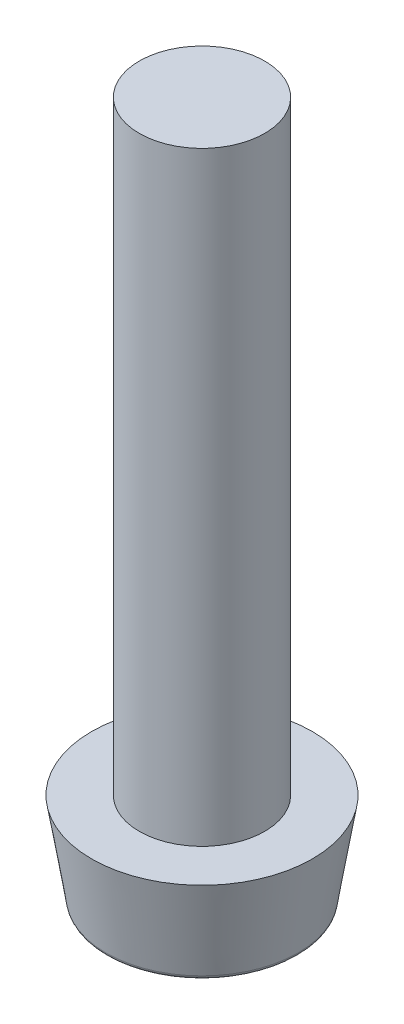
ISO-10303-21;
HEADER;
FILE_DESCRIPTION(('STEP AP214'),'2;1');
FILE_NAME('part.step','',(''),(''),'','','');
FILE_SCHEMA(('AUTOMOTIVE_DESIGN { 1 0 10303 214 1 1 1 1 }'));
ENDSEC;
DATA;
#1=APPLICATION_CONTEXT('core data for automotive mechanical design processes');
#2=APPLICATION_PROTOCOL_DEFINITION('international standard','automotive_design',2000,#1);
#3=PRODUCT_CONTEXT('',#1,'mechanical');
#4=PRODUCT('Part','Part','',(#3));
#5=PRODUCT_RELATED_PRODUCT_CATEGORY('part','',(#4));
#6=PRODUCT_DEFINITION_FORMATION('','',#4);
#7=PRODUCT_DEFINITION_CONTEXT('part definition',#1,'design');
#8=PRODUCT_DEFINITION('design','',#6,#7);
#9=PRODUCT_DEFINITION_SHAPE('','',#8);
#10=(LENGTH_UNIT() NAMED_UNIT(*) SI_UNIT(.MILLI.,.METRE.));
#11=(NAMED_UNIT(*) PLANE_ANGLE_UNIT() SI_UNIT($,.RADIAN.));
#12=(NAMED_UNIT(*) SI_UNIT($,.STERADIAN.) SOLID_ANGLE_UNIT());
#13=UNCERTAINTY_MEASURE_WITH_UNIT(LENGTH_MEASURE(1.E-05),#10,'distance_accuracy_value','');
#14=(GEOMETRIC_REPRESENTATION_CONTEXT(3) GLOBAL_UNCERTAINTY_ASSIGNED_CONTEXT((#13)) GLOBAL_UNIT_ASSIGNED_CONTEXT((#10,
#11,#12)) REPRESENTATION_CONTEXT('',''));
#15=CARTESIAN_POINT('',(0.,0.,0.));
#16=DIRECTION('',(0.,0.,1.));
#17=DIRECTION('',(1.,0.,0.));
#18=AXIS2_PLACEMENT_3D('',#15,#16,#17);
#19=CARTESIAN_POINT('',(0.,1.85,0.));
#20=DIRECTION('',(0.,1.,0.));
#21=DIRECTION('',(0.,0.,1.));
#22=AXIS2_PLACEMENT_3D('',#19,#20,#21);
#23=PLANE('',#22);
#24=CARTESIAN_POINT('',(0.,1.85,0.));
#25=DIRECTION('',(0.,1.,0.));
#26=DIRECTION('',(0.,0.,1.));
#27=AXIS2_PLACEMENT_3D('',#24,#25,#26);
#28=CIRCLE('',#27,1.25);
#29=CARTESIAN_POINT('',(0.,1.85,1.25));
#30=VERTEX_POINT('',#29);
#31=EDGE_CURVE('E50',#30,#30,#28,.T.);
#32=ORIENTED_EDGE('',*,*,#31,.F.);
#33=EDGE_LOOP('',(#32));
#34=FACE_BOUND('',#33,.T.);
#35=CARTESIAN_POINT('',(0.,1.85,0.));
#36=DIRECTION('',(0.,1.,0.));
#37=DIRECTION('',(0.,0.,1.));
#38=AXIS2_PLACEMENT_3D('',#35,#36,#37);
#39=CIRCLE('',#38,2.19999999999999);
#40=CARTESIAN_POINT('',(0.,1.85,2.19999999999999));
#41=VERTEX_POINT('',#40);
#42=EDGE_CURVE('E55',#41,#41,#39,.T.);
#43=ORIENTED_EDGE('',*,*,#42,.T.);
#44=EDGE_LOOP('',(#43));
#45=FACE_BOUND('',#44,.T.);
#46=ADVANCED_FACE('F37',(#34,#45),#23,.T.);
#47=CARTESIAN_POINT('',(0.,0.,0.));
#48=DIRECTION('',(0.,1.,0.));
#49=DIRECTION('',(0.,0.,1.));
#50=AXIS2_PLACEMENT_3D('',#47,#48,#49);
#51=PLANE('',#50);
#52=CARTESIAN_POINT('',(0.,0.,0.));
#53=DIRECTION('',(0.,1.,0.));
#54=DIRECTION('',(0.,0.,1.));
#55=AXIS2_PLACEMENT_3D('',#52,#53,#54);
#56=CIRCLE('',#55,1.81490991992436);
#57=CARTESIAN_POINT('',(0.,0.,1.81490991992436));
#58=VERTEX_POINT('',#57);
#59=EDGE_CURVE('E45',#58,#58,#56,.F.);
#60=ORIENTED_EDGE('',*,*,#59,.T.);
#61=EDGE_LOOP('',(#60));
#62=FACE_BOUND('',#61,.T.);
#63=ADVANCED_FACE('F71',(#62),#51,.F.);
#64=CARTESIAN_POINT('',(0.,13.9,0.));
#65=DIRECTION('',(0.,-1.,0.));
#66=DIRECTION('',(0.,0.,-1.));
#67=AXIS2_PLACEMENT_3D('',#64,#65,#66);
#68=CYLINDRICAL_SURFACE('',#67,1.25);
#69=CARTESIAN_POINT('',(0.,13.9,0.));
#70=DIRECTION('',(0.,1.,0.));
#71=DIRECTION('',(0.,0.,1.));
#72=AXIS2_PLACEMENT_3D('',#69,#70,#71);
#73=CIRCLE('',#72,1.25);
#74=CARTESIAN_POINT('',(0.,13.9,1.25));
#75=VERTEX_POINT('',#74);
#76=EDGE_CURVE('E60',#75,#75,#73,.T.);
#77=ORIENTED_EDGE('',*,*,#76,.F.);
#78=EDGE_LOOP('',(#77));
#79=FACE_BOUND('',#78,.T.);
#80=ORIENTED_EDGE('',*,*,#31,.T.);
#81=EDGE_LOOP('',(#80));
#82=FACE_BOUND('',#81,.T.);
#83=ADVANCED_FACE('F68',(#79,#82),#68,.T.);
#84=CARTESIAN_POINT('',(0.,13.9,0.));
#85=DIRECTION('',(0.,1.,0.));
#86=DIRECTION('',(0.,0.,1.));
#87=AXIS2_PLACEMENT_3D('',#84,#85,#86);
#88=PLANE('',#87);
#89=ORIENTED_EDGE('',*,*,#76,.T.);
#90=EDGE_LOOP('',(#89));
#91=FACE_BOUND('',#90,.T.);
#92=ADVANCED_FACE('F66',(#91),#88,.T.);
#93=CARTESIAN_POINT('',(0.,1.85000000000005,0.));
#94=DIRECTION('',(0.,1.,0.));
#95=DIRECTION('',(0.,0.,1.));
#96=AXIS2_PLACEMENT_3D('',#93,#94,#95);
#97=CONICAL_SURFACE('',#96,2.19999999999999,0.160762740625832);
#98=CARTESIAN_POINT('',(0.,0.0839928841446341,0.));
#99=DIRECTION('',(0.,1.,0.));
#100=DIRECTION('',(0.,0.,1.));
#101=AXIS2_PLACEMENT_3D('',#98,#99,#100);
#102=CIRCLE('',#101,1.91362046769912);
#103=CARTESIAN_POINT('',(0.,0.0839928841446341,1.91362046769912));
#104=VERTEX_POINT('',#103);
#105=EDGE_CURVE('E10',#104,#104,#102,.T.);
#106=ORIENTED_EDGE('',*,*,#105,.T.);
#107=EDGE_LOOP('',(#106));
#108=FACE_BOUND('',#107,.T.);
#109=ORIENTED_EDGE('',*,*,#42,.F.);
#110=EDGE_LOOP('',(#109));
#111=FACE_BOUND('',#110,.T.);
#112=ADVANCED_FACE('F80',(#108,#111),#97,.T.);
#113=CARTESIAN_POINT('',(0.,0.1,0.));
#114=DIRECTION('',(0.,1.,0.));
#115=DIRECTION('',(0.,0.,1.));
#116=AXIS2_PLACEMENT_3D('',#113,#114,#115);
#117=TOROIDAL_SURFACE('',#116,1.81490991992436,0.1);
#118=ORIENTED_EDGE('',*,*,#105,.F.);
#119=EDGE_LOOP('',(#118));
#120=FACE_BOUND('',#119,.T.);
#121=ORIENTED_EDGE('',*,*,#59,.F.);
#122=EDGE_LOOP('',(#121));
#123=FACE_BOUND('',#122,.T.);
#124=ADVANCED_FACE('F39',(#120,#123),#117,.T.);
#125=CLOSED_SHELL('',(#46,#63,#83,#92,#112,#124));
#126=MANIFOLD_SOLID_BREP('B2',#125);
#127=ADVANCED_BREP_SHAPE_REPRESENTATION('',(#18,#126),#14);
#128=SHAPE_DEFINITION_REPRESENTATION(#9,#127);
ENDSEC;
END-ISO-10303-21;
